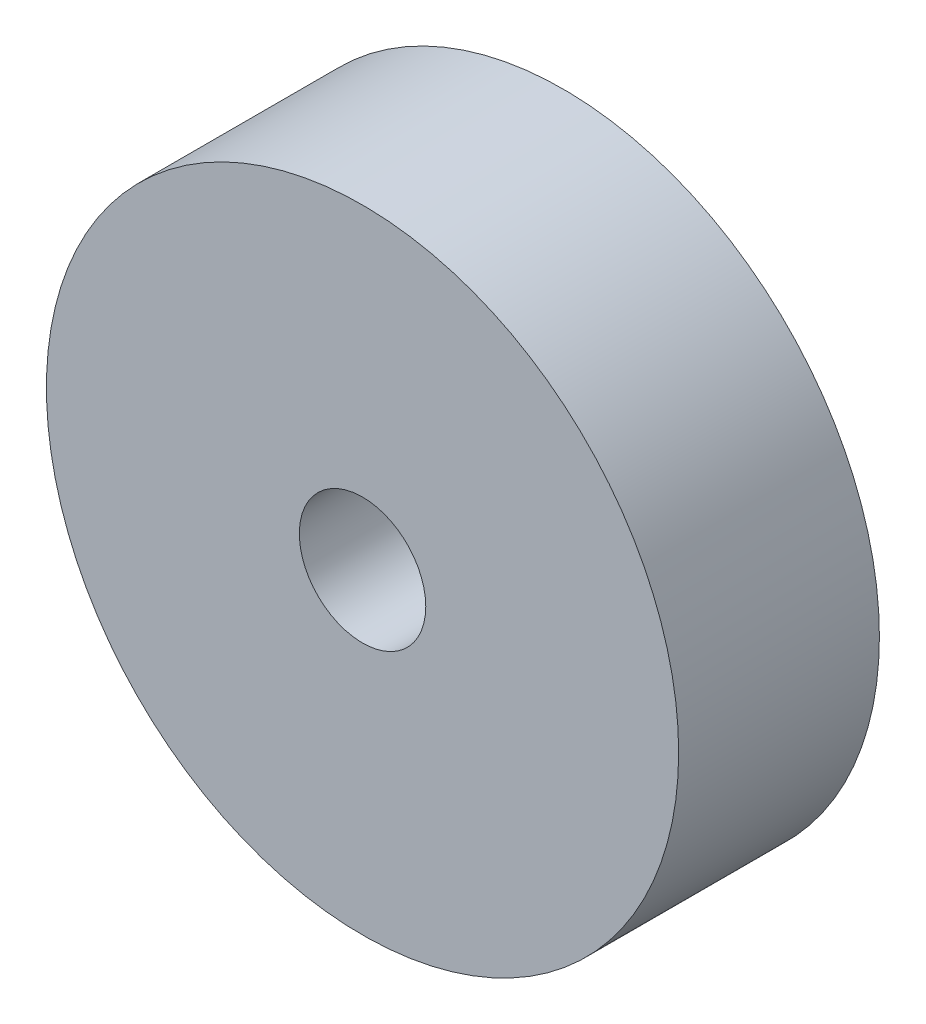
ISO-10303-21;
HEADER;
FILE_DESCRIPTION(('STEP AP214'),'2;1');
FILE_NAME('part.step','',(''),(''),'','','');
FILE_SCHEMA(('AUTOMOTIVE_DESIGN { 1 0 10303 214 1 1 1 1 }'));
ENDSEC;
DATA;
#1=APPLICATION_CONTEXT('core data for automotive mechanical design processes');
#2=APPLICATION_PROTOCOL_DEFINITION('international standard','automotive_design',2000,#1);
#3=PRODUCT_CONTEXT('',#1,'mechanical');
#4=PRODUCT('Part','Part','',(#3));
#5=PRODUCT_RELATED_PRODUCT_CATEGORY('part','',(#4));
#6=PRODUCT_DEFINITION_FORMATION('','',#4);
#7=PRODUCT_DEFINITION_CONTEXT('part definition',#1,'design');
#8=PRODUCT_DEFINITION('design','',#6,#7);
#9=PRODUCT_DEFINITION_SHAPE('','',#8);
#10=(LENGTH_UNIT() NAMED_UNIT(*) SI_UNIT(.MILLI.,.METRE.));
#11=(NAMED_UNIT(*) PLANE_ANGLE_UNIT() SI_UNIT($,.RADIAN.));
#12=(NAMED_UNIT(*) SI_UNIT($,.STERADIAN.) SOLID_ANGLE_UNIT());
#13=UNCERTAINTY_MEASURE_WITH_UNIT(LENGTH_MEASURE(1.E-05),#10,'distance_accuracy_value','');
#14=(GEOMETRIC_REPRESENTATION_CONTEXT(3) GLOBAL_UNCERTAINTY_ASSIGNED_CONTEXT((#13)) GLOBAL_UNIT_ASSIGNED_CONTEXT((#10,
#11,#12)) REPRESENTATION_CONTEXT('',''));
#15=CARTESIAN_POINT('',(0.,0.,0.));
#16=DIRECTION('',(0.,0.,1.));
#17=DIRECTION('',(1.,0.,0.));
#18=AXIS2_PLACEMENT_3D('',#15,#16,#17);
#19=CARTESIAN_POINT('',(0.,0.,6.35));
#20=DIRECTION('',(0.,0.,1.));
#21=DIRECTION('',(1.,0.,0.));
#22=AXIS2_PLACEMENT_3D('',#19,#20,#21);
#23=PLANE('',#22);
#24=CARTESIAN_POINT('',(0.,0.,6.35));
#25=DIRECTION('',(0.,0.,1.));
#26=DIRECTION('',(1.,0.,0.));
#27=AXIS2_PLACEMENT_3D('',#24,#25,#26);
#28=CIRCLE('',#27,10.);
#29=CARTESIAN_POINT('',(10.,0.,6.35));
#30=VERTEX_POINT('',#29);
#31=EDGE_CURVE('E10',#30,#30,#28,.T.);
#32=ORIENTED_EDGE('',*,*,#31,.T.);
#33=EDGE_LOOP('',(#32));
#34=FACE_BOUND('',#33,.T.);
#35=CARTESIAN_POINT('',(0.,0.,6.35));
#36=DIRECTION('',(0.,0.,1.));
#37=DIRECTION('',(1.,0.,0.));
#38=AXIS2_PLACEMENT_3D('',#35,#36,#37);
#39=CIRCLE('',#38,2.);
#40=CARTESIAN_POINT('',(2.,0.,6.35));
#41=VERTEX_POINT('',#40);
#42=EDGE_CURVE('E43',#41,#41,#39,.T.);
#43=ORIENTED_EDGE('',*,*,#42,.F.);
#44=EDGE_LOOP('',(#43));
#45=FACE_BOUND('',#44,.T.);
#46=ADVANCED_FACE('F32',(#34,#45),#23,.T.);
#47=CARTESIAN_POINT('',(0.,0.,0.));
#48=DIRECTION('',(0.,0.,1.));
#49=DIRECTION('',(1.,0.,0.));
#50=AXIS2_PLACEMENT_3D('',#47,#48,#49);
#51=PLANE('',#50);
#52=CARTESIAN_POINT('',(0.,0.,0.));
#53=DIRECTION('',(0.,0.,1.));
#54=DIRECTION('',(1.,0.,0.));
#55=AXIS2_PLACEMENT_3D('',#52,#53,#54);
#56=CIRCLE('',#55,10.);
#57=CARTESIAN_POINT('',(10.,0.,0.));
#58=VERTEX_POINT('',#57);
#59=EDGE_CURVE('E36',#58,#58,#56,.T.);
#60=ORIENTED_EDGE('',*,*,#59,.F.);
#61=EDGE_LOOP('',(#60));
#62=FACE_BOUND('',#61,.T.);
#63=CARTESIAN_POINT('',(0.,0.,0.));
#64=DIRECTION('',(0.,0.,1.));
#65=DIRECTION('',(1.,0.,0.));
#66=AXIS2_PLACEMENT_3D('',#63,#64,#65);
#67=CIRCLE('',#66,2.);
#68=CARTESIAN_POINT('',(2.,0.,0.));
#69=VERTEX_POINT('',#68);
#70=EDGE_CURVE('E45',#69,#69,#67,.T.);
#71=ORIENTED_EDGE('',*,*,#70,.T.);
#72=EDGE_LOOP('',(#71));
#73=FACE_BOUND('',#72,.T.);
#74=ADVANCED_FACE('F55',(#62,#73),#51,.F.);
#75=CARTESIAN_POINT('',(0.,0.,6.35));
#76=DIRECTION('',(0.,0.,-1.));
#77=DIRECTION('',(-1.,0.,0.));
#78=AXIS2_PLACEMENT_3D('',#75,#76,#77);
#79=CYLINDRICAL_SURFACE('',#78,10.);
#80=ORIENTED_EDGE('',*,*,#31,.F.);
#81=EDGE_LOOP('',(#80));
#82=FACE_BOUND('',#81,.T.);
#83=ORIENTED_EDGE('',*,*,#59,.T.);
#84=EDGE_LOOP('',(#83));
#85=FACE_BOUND('',#84,.T.);
#86=ADVANCED_FACE('F34',(#82,#85),#79,.T.);
#87=CARTESIAN_POINT('',(0.,0.,6.35));
#88=DIRECTION('',(0.,0.,-1.));
#89=DIRECTION('',(-1.,0.,0.));
#90=AXIS2_PLACEMENT_3D('',#87,#88,#89);
#91=CYLINDRICAL_SURFACE('',#90,2.);
#92=ORIENTED_EDGE('',*,*,#42,.T.);
#93=EDGE_LOOP('',(#92));
#94=FACE_BOUND('',#93,.T.);
#95=ORIENTED_EDGE('',*,*,#70,.F.);
#96=EDGE_LOOP('',(#95));
#97=FACE_BOUND('',#96,.T.);
#98=ADVANCED_FACE('F51',(#94,#97),#91,.F.);
#99=CLOSED_SHELL('',(#46,#74,#86,#98));
#100=MANIFOLD_SOLID_BREP('B2',#99);
#101=ADVANCED_BREP_SHAPE_REPRESENTATION('',(#18,#100),#14);
#102=SHAPE_DEFINITION_REPRESENTATION(#9,#101);
ENDSEC;
END-ISO-10303-21;
